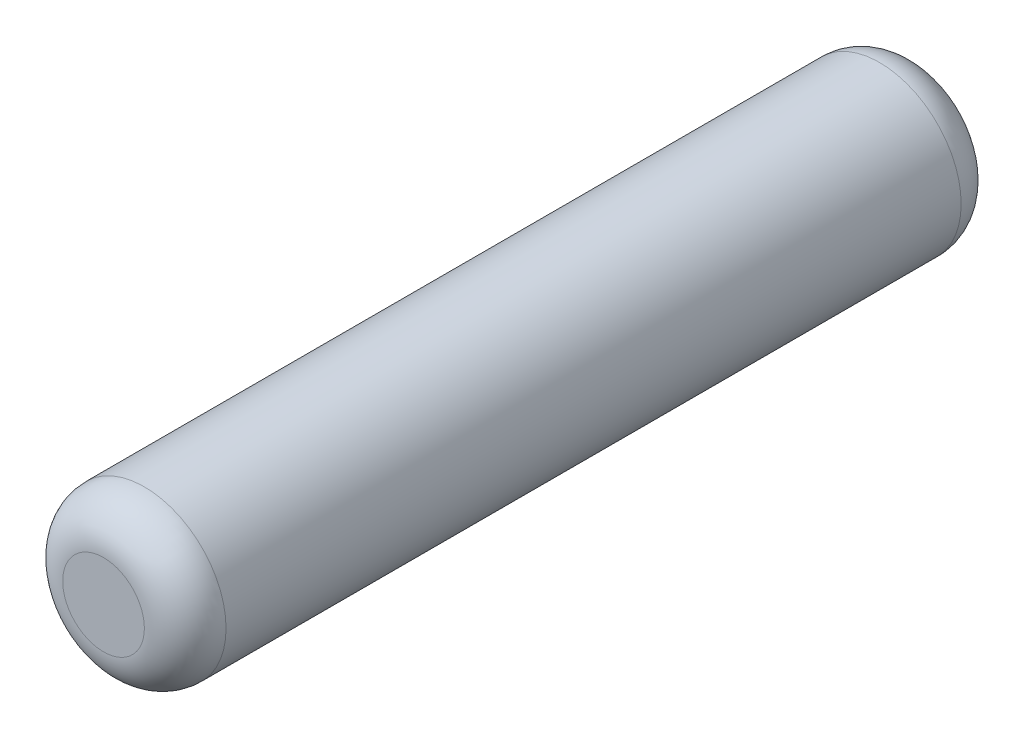
ISO-10303-21;
HEADER;
FILE_DESCRIPTION(('STEP AP214'),'2;1');
FILE_NAME('part.step','',(''),(''),'','','');
FILE_SCHEMA(('AUTOMOTIVE_DESIGN { 1 0 10303 214 1 1 1 1 }'));
ENDSEC;
DATA;
#1=APPLICATION_CONTEXT('core data for automotive mechanical design processes');
#2=APPLICATION_PROTOCOL_DEFINITION('international standard','automotive_design',2000,#1);
#3=PRODUCT_CONTEXT('',#1,'mechanical');
#4=PRODUCT('Part','Part','',(#3));
#5=PRODUCT_RELATED_PRODUCT_CATEGORY('part','',(#4));
#6=PRODUCT_DEFINITION_FORMATION('','',#4);
#7=PRODUCT_DEFINITION_CONTEXT('part definition',#1,'design');
#8=PRODUCT_DEFINITION('design','',#6,#7);
#9=PRODUCT_DEFINITION_SHAPE('','',#8);
#10=(LENGTH_UNIT() NAMED_UNIT(*) SI_UNIT(.MILLI.,.METRE.));
#11=(NAMED_UNIT(*) PLANE_ANGLE_UNIT() SI_UNIT($,.RADIAN.));
#12=(NAMED_UNIT(*) SI_UNIT($,.STERADIAN.) SOLID_ANGLE_UNIT());
#13=UNCERTAINTY_MEASURE_WITH_UNIT(LENGTH_MEASURE(1.E-05),#10,'distance_accuracy_value','');
#14=(GEOMETRIC_REPRESENTATION_CONTEXT(3) GLOBAL_UNCERTAINTY_ASSIGNED_CONTEXT((#13)) GLOBAL_UNIT_ASSIGNED_CONTEXT((#10,
#11,#12)) REPRESENTATION_CONTEXT('',''));
#15=CARTESIAN_POINT('',(0.,0.,0.));
#16=DIRECTION('',(0.,0.,1.));
#17=DIRECTION('',(1.,0.,0.));
#18=AXIS2_PLACEMENT_3D('',#15,#16,#17);
#19=CARTESIAN_POINT('',(0.,0.,20.));
#20=DIRECTION('',(0.,0.,-1.));
#21=DIRECTION('',(-1.,0.,0.));
#22=AXIS2_PLACEMENT_3D('',#19,#20,#21);
#23=CYLINDRICAL_SURFACE('',#22,2.);
#24=CARTESIAN_POINT('',(0.,0.,1.));
#25=DIRECTION('',(0.,0.,1.));
#26=DIRECTION('',(1.,0.,0.));
#27=AXIS2_PLACEMENT_3D('',#24,#25,#26);
#28=CIRCLE('',#27,2.);
#29=CARTESIAN_POINT('',(2.,0.,1.));
#30=VERTEX_POINT('',#29);
#31=EDGE_CURVE('E41',#30,#30,#28,.T.);
#32=ORIENTED_EDGE('',*,*,#31,.T.);
#33=EDGE_LOOP('',(#32));
#34=FACE_BOUND('',#33,.T.);
#35=CARTESIAN_POINT('',(0.,0.,19.));
#36=DIRECTION('',(0.,0.,1.));
#37=DIRECTION('',(1.,0.,0.));
#38=AXIS2_PLACEMENT_3D('',#35,#36,#37);
#39=CIRCLE('',#38,2.);
#40=CARTESIAN_POINT('',(2.,0.,19.));
#41=VERTEX_POINT('',#40);
#42=EDGE_CURVE('E45',#41,#41,#39,.F.);
#43=ORIENTED_EDGE('',*,*,#42,.T.);
#44=EDGE_LOOP('',(#43));
#45=FACE_BOUND('',#44,.T.);
#46=ADVANCED_FACE('F31',(#34,#45),#23,.T.);
#47=CARTESIAN_POINT('',(0.,0.,20.));
#48=DIRECTION('',(0.,0.,1.));
#49=DIRECTION('',(1.,0.,0.));
#50=AXIS2_PLACEMENT_3D('',#47,#48,#49);
#51=PLANE('',#50);
#52=CARTESIAN_POINT('',(0.,0.,20.));
#53=DIRECTION('',(0.,0.,1.));
#54=DIRECTION('',(1.,0.,0.));
#55=AXIS2_PLACEMENT_3D('',#52,#53,#54);
#56=CIRCLE('',#55,1.);
#57=CARTESIAN_POINT('',(1.,0.,20.));
#58=VERTEX_POINT('',#57);
#59=EDGE_CURVE('E10',#58,#58,#56,.T.);
#60=ORIENTED_EDGE('',*,*,#59,.T.);
#61=EDGE_LOOP('',(#60));
#62=FACE_BOUND('',#61,.T.);
#63=ADVANCED_FACE('F63',(#62),#51,.T.);
#64=CARTESIAN_POINT('',(0.,0.,0.));
#65=DIRECTION('',(0.,0.,1.));
#66=DIRECTION('',(1.,0.,0.));
#67=AXIS2_PLACEMENT_3D('',#64,#65,#66);
#68=PLANE('',#67);
#69=CARTESIAN_POINT('',(0.,0.,0.));
#70=DIRECTION('',(0.,0.,1.));
#71=DIRECTION('',(1.,0.,0.));
#72=AXIS2_PLACEMENT_3D('',#69,#70,#71);
#73=CIRCLE('',#72,1.);
#74=CARTESIAN_POINT('',(1.,0.,0.));
#75=VERTEX_POINT('',#74);
#76=EDGE_CURVE('E37',#75,#75,#73,.F.);
#77=ORIENTED_EDGE('',*,*,#76,.T.);
#78=EDGE_LOOP('',(#77));
#79=FACE_BOUND('',#78,.T.);
#80=ADVANCED_FACE('F60',(#79),#68,.F.);
#81=CARTESIAN_POINT('',(0.,0.,1.));
#82=DIRECTION('',(0.,0.,1.));
#83=DIRECTION('',(1.,0.,0.));
#84=AXIS2_PLACEMENT_3D('',#81,#82,#83);
#85=DEGENERATE_TOROIDAL_SURFACE('',#84,1.,1.,.T.);
#86=ORIENTED_EDGE('',*,*,#76,.F.);
#87=EDGE_LOOP('',(#86));
#88=FACE_BOUND('',#87,.T.);
#89=ORIENTED_EDGE('',*,*,#31,.F.);
#90=EDGE_LOOP('',(#89));
#91=FACE_BOUND('',#90,.T.);
#92=ADVANCED_FACE('F55',(#88,#91),#85,.T.);
#93=CARTESIAN_POINT('',(0.,0.,19.));
#94=DIRECTION('',(0.,0.,1.));
#95=DIRECTION('',(1.,0.,0.));
#96=AXIS2_PLACEMENT_3D('',#93,#94,#95);
#97=DEGENERATE_TOROIDAL_SURFACE('',#96,1.,1.,.T.);
#98=ORIENTED_EDGE('',*,*,#42,.F.);
#99=EDGE_LOOP('',(#98));
#100=FACE_BOUND('',#99,.T.);
#101=ORIENTED_EDGE('',*,*,#59,.F.);
#102=EDGE_LOOP('',(#101));
#103=FACE_BOUND('',#102,.T.);
#104=ADVANCED_FACE('F52',(#100,#103),#97,.T.);
#105=CLOSED_SHELL('',(#46,#63,#80,#92,#104));
#106=MANIFOLD_SOLID_BREP('B2',#105);
#107=ADVANCED_BREP_SHAPE_REPRESENTATION('',(#18,#106),#14);
#108=SHAPE_DEFINITION_REPRESENTATION(#9,#107);
ENDSEC;
END-ISO-10303-21;
